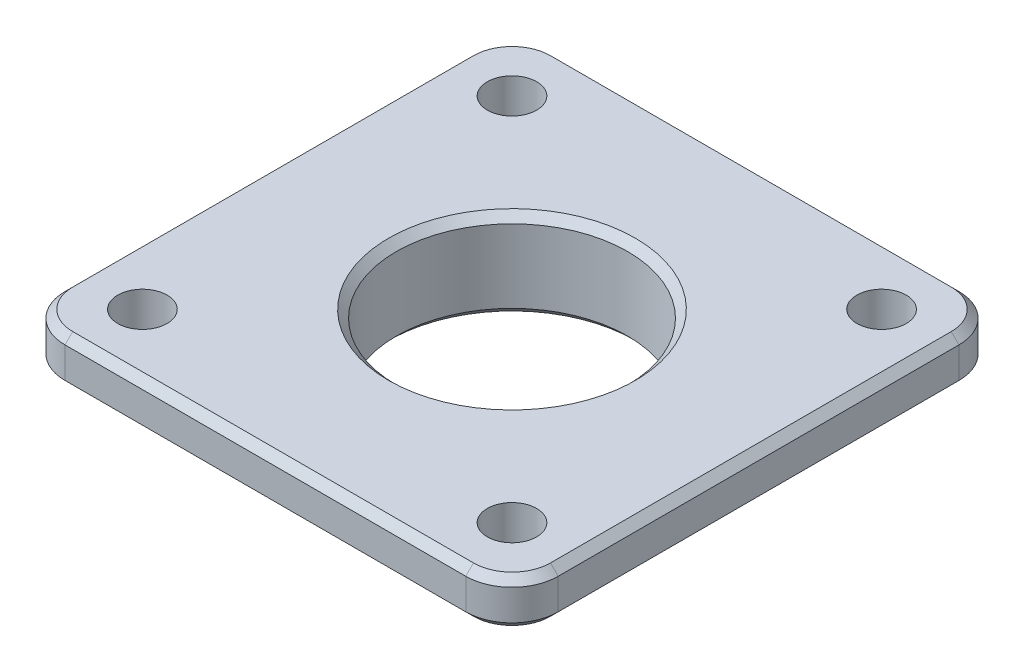
ISO-10303-21;
HEADER;
FILE_DESCRIPTION(('STEP AP214'),'2;1');
FILE_NAME('part.step','',(''),(''),'','','');
FILE_SCHEMA(('AUTOMOTIVE_DESIGN { 1 0 10303 214 1 1 1 1 }'));
ENDSEC;
DATA;
#1=APPLICATION_CONTEXT('core data for automotive mechanical design processes');
#2=APPLICATION_PROTOCOL_DEFINITION('international standard','automotive_design',2000,#1);
#3=PRODUCT_CONTEXT('',#1,'mechanical');
#4=PRODUCT('Part','Part','',(#3));
#5=PRODUCT_RELATED_PRODUCT_CATEGORY('part','',(#4));
#6=PRODUCT_DEFINITION_FORMATION('','',#4);
#7=PRODUCT_DEFINITION_CONTEXT('part definition',#1,'design');
#8=PRODUCT_DEFINITION('design','',#6,#7);
#9=PRODUCT_DEFINITION_SHAPE('','',#8);
#10=(LENGTH_UNIT() NAMED_UNIT(*) SI_UNIT(.MILLI.,.METRE.));
#11=(NAMED_UNIT(*) PLANE_ANGLE_UNIT() SI_UNIT($,.RADIAN.));
#12=(NAMED_UNIT(*) SI_UNIT($,.STERADIAN.) SOLID_ANGLE_UNIT());
#13=UNCERTAINTY_MEASURE_WITH_UNIT(LENGTH_MEASURE(1.E-05),#10,'distance_accuracy_value','');
#14=(GEOMETRIC_REPRESENTATION_CONTEXT(3) GLOBAL_UNCERTAINTY_ASSIGNED_CONTEXT((#13)) GLOBAL_UNIT_ASSIGNED_CONTEXT((#10,
#11,#12)) REPRESENTATION_CONTEXT('',''));
#15=CARTESIAN_POINT('',(0.,0.,0.));
#16=DIRECTION('',(0.,0.,1.));
#17=DIRECTION('',(1.,0.,0.));
#18=AXIS2_PLACEMENT_3D('',#15,#16,#17);
#19=CARTESIAN_POINT('',(-13.,0.,-13.));
#20=DIRECTION('',(0.,1.,0.));
#21=DIRECTION('',(0.,0.,1.));
#22=AXIS2_PLACEMENT_3D('',#19,#20,#21);
#23=PLANE('',#22);
#24=CARTESIAN_POINT('',(13.,0.,-13.));
#25=DIRECTION('',(0.,1.,0.));
#26=DIRECTION('',(0.,0.,1.));
#27=AXIS2_PLACEMENT_3D('',#24,#25,#26);
#28=CIRCLE('',#27,2.5);
#29=CARTESIAN_POINT('',(13.,0.,-15.5));
#30=VERTEX_POINT('',#29);
#31=CARTESIAN_POINT('',(15.5,0.,-13.));
#32=VERTEX_POINT('',#31);
#33=EDGE_CURVE('E299',#30,#32,#28,.F.);
#34=ORIENTED_EDGE('',*,*,#33,.T.);
#35=DIRECTION('',(0.,0.,1.));
#36=VECTOR('',#35,1.);
#37=CARTESIAN_POINT('',(15.5,0.,-13.));
#38=LINE('',#37,#36);
#39=CARTESIAN_POINT('',(15.5,0.,13.));
#40=VERTEX_POINT('',#39);
#41=EDGE_CURVE('E161',#32,#40,#38,.T.);
#42=ORIENTED_EDGE('',*,*,#41,.T.);
#43=CARTESIAN_POINT('',(13.,0.,13.));
#44=DIRECTION('',(0.,1.,0.));
#45=DIRECTION('',(0.,0.,1.));
#46=AXIS2_PLACEMENT_3D('',#43,#44,#45);
#47=CIRCLE('',#46,2.5);
#48=CARTESIAN_POINT('',(13.,0.,15.5));
#49=VERTEX_POINT('',#48);
#50=EDGE_CURVE('E297',#40,#49,#47,.F.);
#51=ORIENTED_EDGE('',*,*,#50,.T.);
#52=DIRECTION('',(-1.,0.,0.));
#53=VECTOR('',#52,1.);
#54=CARTESIAN_POINT('',(-13.,0.,15.5));
#55=LINE('',#54,#53);
#56=CARTESIAN_POINT('',(-13.,0.,15.5));
#57=VERTEX_POINT('',#56);
#58=EDGE_CURVE('E293',#49,#57,#55,.T.);
#59=ORIENTED_EDGE('',*,*,#58,.T.);
#60=CARTESIAN_POINT('',(-13.,0.,13.));
#61=DIRECTION('',(0.,1.,0.));
#62=DIRECTION('',(0.,0.,1.));
#63=AXIS2_PLACEMENT_3D('',#60,#61,#62);
#64=CIRCLE('',#63,2.5);
#65=CARTESIAN_POINT('',(-15.5,0.,13.));
#66=VERTEX_POINT('',#65);
#67=EDGE_CURVE('E289',#57,#66,#64,.F.);
#68=ORIENTED_EDGE('',*,*,#67,.T.);
#69=DIRECTION('',(0.,0.,-1.));
#70=VECTOR('',#69,1.);
#71=CARTESIAN_POINT('',(-15.5,0.,-13.));
#72=LINE('',#71,#70);
#73=CARTESIAN_POINT('',(-15.5,0.,-13.));
#74=VERTEX_POINT('',#73);
#75=EDGE_CURVE('E287',#66,#74,#72,.T.);
#76=ORIENTED_EDGE('',*,*,#75,.T.);
#77=CARTESIAN_POINT('',(-13.,0.,-13.));
#78=DIRECTION('',(0.,1.,0.));
#79=DIRECTION('',(0.,0.,1.));
#80=AXIS2_PLACEMENT_3D('',#77,#78,#79);
#81=CIRCLE('',#80,2.5);
#82=CARTESIAN_POINT('',(-13.,0.,-15.5));
#83=VERTEX_POINT('',#82);
#84=EDGE_CURVE('E291',#74,#83,#81,.F.);
#85=ORIENTED_EDGE('',*,*,#84,.T.);
#86=DIRECTION('',(1.,0.,0.));
#87=VECTOR('',#86,1.);
#88=CARTESIAN_POINT('',(-13.,0.,-15.5));
#89=LINE('',#88,#87);
#90=EDGE_CURVE('E295',#83,#30,#89,.T.);
#91=ORIENTED_EDGE('',*,*,#90,.T.);
#92=EDGE_LOOP('',(#34,#42,#51,#59,#68,#76,#85,#91));
#93=FACE_BOUND('',#92,.T.);
#94=CARTESIAN_POINT('',(-11.988995475018,0.,11.9889954750179));
#95=DIRECTION('',(0.,1.,0.));
#96=DIRECTION('',(0.,0.,-1.));
#97=AXIS2_PLACEMENT_3D('',#94,#95,#96);
#98=CIRCLE('',#97,1.6);
#99=CARTESIAN_POINT('',(-11.988995475018,0.,10.3889954750179));
#100=VERTEX_POINT('',#99);
#101=EDGE_CURVE('E236',#100,#100,#98,.T.);
#102=ORIENTED_EDGE('',*,*,#101,.T.);
#103=EDGE_LOOP('',(#102));
#104=FACE_BOUND('',#103,.T.);
#105=CARTESIAN_POINT('',(11.988995475018,0.,11.9889954750178));
#106=DIRECTION('',(0.,1.,0.));
#107=DIRECTION('',(0.,0.,1.));
#108=AXIS2_PLACEMENT_3D('',#105,#106,#107);
#109=CIRCLE('',#108,1.6);
#110=CARTESIAN_POINT('',(11.988995475018,0.,13.5889954750178));
#111=VERTEX_POINT('',#110);
#112=EDGE_CURVE('E247',#111,#111,#109,.T.);
#113=ORIENTED_EDGE('',*,*,#112,.T.);
#114=EDGE_LOOP('',(#113));
#115=FACE_BOUND('',#114,.T.);
#116=CARTESIAN_POINT('',(11.988995475018,0.,-11.9889954750178));
#117=DIRECTION('',(0.,1.,0.));
#118=DIRECTION('',(0.,0.,-1.));
#119=AXIS2_PLACEMENT_3D('',#116,#117,#118);
#120=CIRCLE('',#119,1.6);
#121=CARTESIAN_POINT('',(11.988995475018,0.,-13.5889954750178));
#122=VERTEX_POINT('',#121);
#123=EDGE_CURVE('E253',#122,#122,#120,.T.);
#124=ORIENTED_EDGE('',*,*,#123,.T.);
#125=EDGE_LOOP('',(#124));
#126=FACE_BOUND('',#125,.T.);
#127=CARTESIAN_POINT('',(-11.988995475018,0.,-11.9889954750178));
#128=DIRECTION('',(0.,1.,0.));
#129=DIRECTION('',(0.,0.,1.));
#130=AXIS2_PLACEMENT_3D('',#127,#128,#129);
#131=CIRCLE('',#130,1.6);
#132=CARTESIAN_POINT('',(-11.988995475018,0.,-10.3889954750178));
#133=VERTEX_POINT('',#132);
#134=EDGE_CURVE('E259',#133,#133,#131,.T.);
#135=ORIENTED_EDGE('',*,*,#134,.T.);
#136=EDGE_LOOP('',(#135));
#137=FACE_BOUND('',#136,.T.);
#138=CARTESIAN_POINT('',(0.,0.,0.));
#139=DIRECTION('',(0.,1.,0.));
#140=DIRECTION('',(0.,0.,1.));
#141=AXIS2_PLACEMENT_3D('',#138,#139,#140);
#142=CIRCLE('',#141,12.3);
#143=CARTESIAN_POINT('',(0.,0.,12.3));
#144=VERTEX_POINT('',#143);
#145=EDGE_CURVE('E177',#144,#144,#142,.F.);
#146=ORIENTED_EDGE('',*,*,#145,.F.);
#147=EDGE_LOOP('',(#146));
#148=FACE_BOUND('',#147,.T.);
#149=ADVANCED_FACE('F32',(#93,#104,#115,#126,#137,#148),#23,.F.);
#150=CARTESIAN_POINT('',(-13.,3.,-13.));
#151=DIRECTION('',(0.,1.,0.));
#152=DIRECTION('',(0.,0.,1.));
#153=AXIS2_PLACEMENT_3D('',#150,#151,#152);
#154=PLANE('',#153);
#155=CARTESIAN_POINT('',(13.,3.,13.));
#156=DIRECTION('',(0.,1.,0.));
#157=DIRECTION('',(0.,0.,1.));
#158=AXIS2_PLACEMENT_3D('',#155,#156,#157);
#159=CIRCLE('',#158,2.50000000000001);
#160=CARTESIAN_POINT('',(13.,3.,15.5));
#161=VERTEX_POINT('',#160);
#162=CARTESIAN_POINT('',(15.5,3.,13.));
#163=VERTEX_POINT('',#162);
#164=EDGE_CURVE('E57',#161,#163,#159,.T.);
#165=ORIENTED_EDGE('',*,*,#164,.T.);
#166=DIRECTION('',(0.,0.,-1.));
#167=VECTOR('',#166,1.);
#168=CARTESIAN_POINT('',(15.5,3.,-13.));
#169=LINE('',#168,#167);
#170=CARTESIAN_POINT('',(15.5,3.,-13.));
#171=VERTEX_POINT('',#170);
#172=EDGE_CURVE('E343',#163,#171,#169,.T.);
#173=ORIENTED_EDGE('',*,*,#172,.T.);
#174=CARTESIAN_POINT('',(13.,3.,-13.));
#175=DIRECTION('',(0.,1.,0.));
#176=DIRECTION('',(0.,0.,1.));
#177=AXIS2_PLACEMENT_3D('',#174,#175,#176);
#178=CIRCLE('',#177,2.50000000000001);
#179=CARTESIAN_POINT('',(13.,3.,-15.5));
#180=VERTEX_POINT('',#179);
#181=EDGE_CURVE('E180',#171,#180,#178,.T.);
#182=ORIENTED_EDGE('',*,*,#181,.T.);
#183=DIRECTION('',(-1.,0.,0.));
#184=VECTOR('',#183,1.);
#185=CARTESIAN_POINT('',(-13.,3.,-15.5));
#186=LINE('',#185,#184);
#187=CARTESIAN_POINT('',(-13.,3.,-15.5));
#188=VERTEX_POINT('',#187);
#189=EDGE_CURVE('E339',#180,#188,#186,.T.);
#190=ORIENTED_EDGE('',*,*,#189,.T.);
#191=CARTESIAN_POINT('',(-13.,3.,-13.));
#192=DIRECTION('',(0.,1.,0.));
#193=DIRECTION('',(0.,0.,1.));
#194=AXIS2_PLACEMENT_3D('',#191,#192,#193);
#195=CIRCLE('',#194,2.50000000000001);
#196=CARTESIAN_POINT('',(-15.5,3.,-13.));
#197=VERTEX_POINT('',#196);
#198=EDGE_CURVE('E335',#188,#197,#195,.T.);
#199=ORIENTED_EDGE('',*,*,#198,.T.);
#200=DIRECTION('',(0.,0.,1.));
#201=VECTOR('',#200,1.);
#202=CARTESIAN_POINT('',(-15.5,3.,13.));
#203=LINE('',#202,#201);
#204=CARTESIAN_POINT('',(-15.5,3.,13.));
#205=VERTEX_POINT('',#204);
#206=EDGE_CURVE('E331',#197,#205,#203,.T.);
#207=ORIENTED_EDGE('',*,*,#206,.T.);
#208=CARTESIAN_POINT('',(-13.,3.,13.));
#209=DIRECTION('',(0.,1.,0.));
#210=DIRECTION('',(0.,0.,1.));
#211=AXIS2_PLACEMENT_3D('',#208,#209,#210);
#212=CIRCLE('',#211,2.50000000000001);
#213=CARTESIAN_POINT('',(-13.,3.,15.5));
#214=VERTEX_POINT('',#213);
#215=EDGE_CURVE('E333',#205,#214,#212,.T.);
#216=ORIENTED_EDGE('',*,*,#215,.T.);
#217=DIRECTION('',(1.,0.,0.));
#218=VECTOR('',#217,1.);
#219=CARTESIAN_POINT('',(13.,3.,15.5));
#220=LINE('',#219,#218);
#221=EDGE_CURVE('E337',#214,#161,#220,.T.);
#222=ORIENTED_EDGE('',*,*,#221,.T.);
#223=EDGE_LOOP('',(#165,#173,#182,#190,#199,#207,#216,#222));
#224=FACE_BOUND('',#223,.T.);
#225=CARTESIAN_POINT('',(0.,3.,0.));
#226=DIRECTION('',(0.,1.,0.));
#227=DIRECTION('',(0.,0.,1.));
#228=AXIS2_PLACEMENT_3D('',#225,#226,#227);
#229=CIRCLE('',#228,8.);
#230=CARTESIAN_POINT('',(0.,3.,8.));
#231=VERTEX_POINT('',#230);
#232=EDGE_CURVE('E328',#231,#231,#229,.F.);
#233=ORIENTED_EDGE('',*,*,#232,.T.);
#234=EDGE_LOOP('',(#233));
#235=FACE_BOUND('',#234,.T.);
#236=CARTESIAN_POINT('',(11.988995475018,3.,11.9889954750178));
#237=DIRECTION('',(0.,1.,0.));
#238=DIRECTION('',(0.,0.,1.));
#239=AXIS2_PLACEMENT_3D('',#236,#237,#238);
#240=CIRCLE('',#239,1.6);
#241=CARTESIAN_POINT('',(11.988995475018,3.,13.5889954750178));
#242=VERTEX_POINT('',#241);
#243=EDGE_CURVE('E250',#242,#242,#240,.T.);
#244=ORIENTED_EDGE('',*,*,#243,.F.);
#245=EDGE_LOOP('',(#244));
#246=FACE_BOUND('',#245,.T.);
#247=CARTESIAN_POINT('',(-11.988995475018,3.,-11.9889954750178));
#248=DIRECTION('',(0.,1.,0.));
#249=DIRECTION('',(0.,0.,1.));
#250=AXIS2_PLACEMENT_3D('',#247,#248,#249);
#251=CIRCLE('',#250,1.6);
#252=CARTESIAN_POINT('',(-11.988995475018,3.,-10.3889954750178));
#253=VERTEX_POINT('',#252);
#254=EDGE_CURVE('E262',#253,#253,#251,.T.);
#255=ORIENTED_EDGE('',*,*,#254,.F.);
#256=EDGE_LOOP('',(#255));
#257=FACE_BOUND('',#256,.T.);
#258=CARTESIAN_POINT('',(11.988995475018,3.,-11.9889954750178));
#259=DIRECTION('',(0.,1.,0.));
#260=DIRECTION('',(0.,0.,-1.));
#261=AXIS2_PLACEMENT_3D('',#258,#259,#260);
#262=CIRCLE('',#261,1.6);
#263=CARTESIAN_POINT('',(11.988995475018,3.,-13.5889954750178));
#264=VERTEX_POINT('',#263);
#265=EDGE_CURVE('E256',#264,#264,#262,.T.);
#266=ORIENTED_EDGE('',*,*,#265,.F.);
#267=EDGE_LOOP('',(#266));
#268=FACE_BOUND('',#267,.T.);
#269=CARTESIAN_POINT('',(-11.988995475018,3.,11.9889954750179));
#270=DIRECTION('',(0.,1.,0.));
#271=DIRECTION('',(0.,0.,-1.));
#272=AXIS2_PLACEMENT_3D('',#269,#270,#271);
#273=CIRCLE('',#272,1.6);
#274=CARTESIAN_POINT('',(-11.988995475018,3.,10.3889954750179));
#275=VERTEX_POINT('',#274);
#276=EDGE_CURVE('E242',#275,#275,#273,.T.);
#277=ORIENTED_EDGE('',*,*,#276,.F.);
#278=EDGE_LOOP('',(#277));
#279=FACE_BOUND('',#278,.T.);
#280=ADVANCED_FACE('F382',(#224,#235,#246,#257,#268,#279),#154,.T.);
#281=CARTESIAN_POINT('',(-13.,3.,-13.));
#282=DIRECTION('',(0.,-1.,0.));
#283=DIRECTION('',(0.,0.,-1.));
#284=AXIS2_PLACEMENT_3D('',#281,#282,#283);
#285=CYLINDRICAL_SURFACE('',#284,3.);
#286=DIRECTION('',(0.,-1.,0.));
#287=VECTOR('',#286,1.);
#288=CARTESIAN_POINT('',(-13.,3.,-16.));
#289=LINE('',#288,#287);
#290=CARTESIAN_POINT('',(-13.,2.5,-16.));
#291=VERTEX_POINT('',#290);
#292=CARTESIAN_POINT('',(-13.,0.5,-16.));
#293=VERTEX_POINT('',#292);
#294=EDGE_CURVE('E265',#291,#293,#289,.T.);
#295=ORIENTED_EDGE('',*,*,#294,.T.);
#296=CARTESIAN_POINT('',(-13.,0.5,-13.));
#297=DIRECTION('',(0.,1.,0.));
#298=DIRECTION('',(0.,0.,1.));
#299=AXIS2_PLACEMENT_3D('',#296,#297,#298);
#300=CIRCLE('',#299,3.);
#301=CARTESIAN_POINT('',(-16.,0.5,-13.));
#302=VERTEX_POINT('',#301);
#303=EDGE_CURVE('E318',#293,#302,#300,.T.);
#304=ORIENTED_EDGE('',*,*,#303,.T.);
#305=DIRECTION('',(0.,-1.,0.));
#306=VECTOR('',#305,1.);
#307=CARTESIAN_POINT('',(-16.,3.,-13.));
#308=LINE('',#307,#306);
#309=CARTESIAN_POINT('',(-16.,2.5,-13.));
#310=VERTEX_POINT('',#309);
#311=EDGE_CURVE('E281',#310,#302,#308,.T.);
#312=ORIENTED_EDGE('',*,*,#311,.F.);
#313=CARTESIAN_POINT('',(-13.,2.5,-13.));
#314=DIRECTION('',(0.,1.,0.));
#315=DIRECTION('',(0.,0.,1.));
#316=AXIS2_PLACEMENT_3D('',#313,#314,#315);
#317=CIRCLE('',#316,3.);
#318=EDGE_CURVE('E316',#310,#291,#317,.F.);
#319=ORIENTED_EDGE('',*,*,#318,.T.);
#320=EDGE_LOOP('',(#295,#304,#312,#319));
#321=FACE_BOUND('',#320,.T.);
#322=ADVANCED_FACE('F388',(#321),#285,.T.);
#323=CARTESIAN_POINT('',(-16.,3.,13.));
#324=DIRECTION('',(1.,0.,0.));
#325=DIRECTION('',(0.,0.,-1.));
#326=AXIS2_PLACEMENT_3D('',#323,#324,#325);
#327=PLANE('',#326);
#328=ORIENTED_EDGE('',*,*,#311,.T.);
#329=DIRECTION('',(0.,0.,1.));
#330=VECTOR('',#329,1.);
#331=CARTESIAN_POINT('',(-16.,0.5,13.));
#332=LINE('',#331,#330);
#333=CARTESIAN_POINT('',(-16.,0.5,13.));
#334=VERTEX_POINT('',#333);
#335=EDGE_CURVE('E326',#302,#334,#332,.T.);
#336=ORIENTED_EDGE('',*,*,#335,.T.);
#337=DIRECTION('',(0.,-1.,0.));
#338=VECTOR('',#337,1.);
#339=CARTESIAN_POINT('',(-16.,3.,13.));
#340=LINE('',#339,#338);
#341=CARTESIAN_POINT('',(-16.,2.5,13.));
#342=VERTEX_POINT('',#341);
#343=EDGE_CURVE('E278',#342,#334,#340,.T.);
#344=ORIENTED_EDGE('',*,*,#343,.F.);
#345=DIRECTION('',(0.,0.,-1.));
#346=VECTOR('',#345,1.);
#347=CARTESIAN_POINT('',(-16.,2.5,-13.));
#348=LINE('',#347,#346);
#349=EDGE_CURVE('E324',#342,#310,#348,.T.);
#350=ORIENTED_EDGE('',*,*,#349,.T.);
#351=EDGE_LOOP('',(#328,#336,#344,#350));
#352=FACE_BOUND('',#351,.T.);
#353=ADVANCED_FACE('F405',(#352),#327,.F.);
#354=CARTESIAN_POINT('',(-13.,3.,13.));
#355=DIRECTION('',(0.,-1.,0.));
#356=DIRECTION('',(0.,0.,-1.));
#357=AXIS2_PLACEMENT_3D('',#354,#355,#356);
#358=CYLINDRICAL_SURFACE('',#357,3.);
#359=ORIENTED_EDGE('',*,*,#343,.T.);
#360=CARTESIAN_POINT('',(-13.,0.5,13.));
#361=DIRECTION('',(0.,1.,0.));
#362=DIRECTION('',(0.,0.,1.));
#363=AXIS2_PLACEMENT_3D('',#360,#361,#362);
#364=CIRCLE('',#363,3.);
#365=CARTESIAN_POINT('',(-13.,0.5,16.));
#366=VERTEX_POINT('',#365);
#367=EDGE_CURVE('E322',#334,#366,#364,.T.);
#368=ORIENTED_EDGE('',*,*,#367,.T.);
#369=DIRECTION('',(0.,-1.,0.));
#370=VECTOR('',#369,1.);
#371=CARTESIAN_POINT('',(-13.,3.,16.));
#372=LINE('',#371,#370);
#373=CARTESIAN_POINT('',(-13.,2.5,16.));
#374=VERTEX_POINT('',#373);
#375=EDGE_CURVE('E275',#374,#366,#372,.T.);
#376=ORIENTED_EDGE('',*,*,#375,.F.);
#377=CARTESIAN_POINT('',(-13.,2.5,13.));
#378=DIRECTION('',(0.,1.,0.));
#379=DIRECTION('',(0.,0.,1.));
#380=AXIS2_PLACEMENT_3D('',#377,#378,#379);
#381=CIRCLE('',#380,3.);
#382=EDGE_CURVE('E320',#374,#342,#381,.F.);
#383=ORIENTED_EDGE('',*,*,#382,.T.);
#384=EDGE_LOOP('',(#359,#368,#376,#383));
#385=FACE_BOUND('',#384,.T.);
#386=ADVANCED_FACE('F401',(#385),#358,.T.);
#387=CARTESIAN_POINT('',(-13.,3.,16.));
#388=DIRECTION('',(0.,0.,-1.));
#389=DIRECTION('',(-1.,0.,0.));
#390=AXIS2_PLACEMENT_3D('',#387,#388,#389);
#391=PLANE('',#390);
#392=ORIENTED_EDGE('',*,*,#375,.T.);
#393=DIRECTION('',(1.,0.,0.));
#394=VECTOR('',#393,1.);
#395=CARTESIAN_POINT('',(-13.,0.5,16.));
#396=LINE('',#395,#394);
#397=CARTESIAN_POINT('',(13.,0.5,16.));
#398=VERTEX_POINT('',#397);
#399=EDGE_CURVE('E314',#366,#398,#396,.T.);
#400=ORIENTED_EDGE('',*,*,#399,.T.);
#401=DIRECTION('',(0.,-1.,0.));
#402=VECTOR('',#401,1.);
#403=CARTESIAN_POINT('',(13.,3.,16.));
#404=LINE('',#403,#402);
#405=CARTESIAN_POINT('',(13.,2.5,16.));
#406=VERTEX_POINT('',#405);
#407=EDGE_CURVE('E272',#406,#398,#404,.T.);
#408=ORIENTED_EDGE('',*,*,#407,.F.);
#409=DIRECTION('',(-1.,0.,0.));
#410=VECTOR('',#409,1.);
#411=CARTESIAN_POINT('',(-13.,2.5,16.));
#412=LINE('',#411,#410);
#413=EDGE_CURVE('E312',#406,#374,#412,.T.);
#414=ORIENTED_EDGE('',*,*,#413,.T.);
#415=EDGE_LOOP('',(#392,#400,#408,#414));
#416=FACE_BOUND('',#415,.T.);
#417=ADVANCED_FACE('F397',(#416),#391,.F.);
#418=CARTESIAN_POINT('',(13.,3.,13.));
#419=DIRECTION('',(0.,-1.,0.));
#420=DIRECTION('',(0.,0.,-1.));
#421=AXIS2_PLACEMENT_3D('',#418,#419,#420);
#422=CYLINDRICAL_SURFACE('',#421,3.);
#423=ORIENTED_EDGE('',*,*,#407,.T.);
#424=CARTESIAN_POINT('',(13.,0.5,13.));
#425=DIRECTION('',(0.,1.,0.));
#426=DIRECTION('',(0.,0.,1.));
#427=AXIS2_PLACEMENT_3D('',#424,#425,#426);
#428=CIRCLE('',#427,3.);
#429=CARTESIAN_POINT('',(16.,0.5,13.));
#430=VERTEX_POINT('',#429);
#431=EDGE_CURVE('E306',#398,#430,#428,.T.);
#432=ORIENTED_EDGE('',*,*,#431,.T.);
#433=DIRECTION('',(0.,-1.,0.));
#434=VECTOR('',#433,1.);
#435=CARTESIAN_POINT('',(16.,3.,13.));
#436=LINE('',#435,#434);
#437=CARTESIAN_POINT('',(16.,2.5,13.));
#438=VERTEX_POINT('',#437);
#439=EDGE_CURVE('E172',#438,#430,#436,.T.);
#440=ORIENTED_EDGE('',*,*,#439,.F.);
#441=CARTESIAN_POINT('',(13.,2.5,13.));
#442=DIRECTION('',(0.,1.,0.));
#443=DIRECTION('',(0.,0.,1.));
#444=AXIS2_PLACEMENT_3D('',#441,#442,#443);
#445=CIRCLE('',#444,3.);
#446=EDGE_CURVE('E304',#438,#406,#445,.F.);
#447=ORIENTED_EDGE('',*,*,#446,.T.);
#448=EDGE_LOOP('',(#423,#432,#440,#447));
#449=FACE_BOUND('',#448,.T.);
#450=ADVANCED_FACE('F394',(#449),#422,.T.);
#451=CARTESIAN_POINT('',(16.,3.,13.));
#452=DIRECTION('',(-1.,0.,0.));
#453=DIRECTION('',(0.,0.,1.));
#454=AXIS2_PLACEMENT_3D('',#451,#452,#453);
#455=PLANE('',#454);
#456=ORIENTED_EDGE('',*,*,#439,.T.);
#457=DIRECTION('',(0.,0.,-1.));
#458=VECTOR('',#457,1.);
#459=CARTESIAN_POINT('',(16.,0.5,13.));
#460=LINE('',#459,#458);
#461=CARTESIAN_POINT('',(16.,0.5,-13.));
#462=VERTEX_POINT('',#461);
#463=EDGE_CURVE('E171',#430,#462,#460,.T.);
#464=ORIENTED_EDGE('',*,*,#463,.T.);
#465=DIRECTION('',(0.,-1.,0.));
#466=VECTOR('',#465,1.);
#467=CARTESIAN_POINT('',(16.,3.,-13.));
#468=LINE('',#467,#466);
#469=CARTESIAN_POINT('',(16.,2.5,-13.));
#470=VERTEX_POINT('',#469);
#471=EDGE_CURVE('E154',#470,#462,#468,.T.);
#472=ORIENTED_EDGE('',*,*,#471,.F.);
#473=DIRECTION('',(0.,0.,1.));
#474=VECTOR('',#473,1.);
#475=CARTESIAN_POINT('',(16.,2.5,13.));
#476=LINE('',#475,#474);
#477=EDGE_CURVE('E168',#470,#438,#476,.T.);
#478=ORIENTED_EDGE('',*,*,#477,.T.);
#479=EDGE_LOOP('',(#456,#464,#472,#478));
#480=FACE_BOUND('',#479,.T.);
#481=ADVANCED_FACE('F167',(#480),#455,.F.);
#482=CARTESIAN_POINT('',(13.,3.,-13.));
#483=DIRECTION('',(0.,-1.,0.));
#484=DIRECTION('',(0.,0.,-1.));
#485=AXIS2_PLACEMENT_3D('',#482,#483,#484);
#486=CYLINDRICAL_SURFACE('',#485,3.);
#487=ORIENTED_EDGE('',*,*,#471,.T.);
#488=CARTESIAN_POINT('',(13.,0.5,-13.));
#489=DIRECTION('',(0.,1.,0.));
#490=DIRECTION('',(0.,0.,1.));
#491=AXIS2_PLACEMENT_3D('',#488,#489,#490);
#492=CIRCLE('',#491,3.);
#493=CARTESIAN_POINT('',(13.,0.5,-16.));
#494=VERTEX_POINT('',#493);
#495=EDGE_CURVE('E160',#462,#494,#492,.T.);
#496=ORIENTED_EDGE('',*,*,#495,.T.);
#497=DIRECTION('',(0.,-1.,0.));
#498=VECTOR('',#497,1.);
#499=CARTESIAN_POINT('',(13.,3.,-16.));
#500=LINE('',#499,#498);
#501=CARTESIAN_POINT('',(13.,2.5,-16.));
#502=VERTEX_POINT('',#501);
#503=EDGE_CURVE('E156',#502,#494,#500,.T.);
#504=ORIENTED_EDGE('',*,*,#503,.F.);
#505=CARTESIAN_POINT('',(13.,2.5,-13.));
#506=DIRECTION('',(0.,1.,0.));
#507=DIRECTION('',(0.,0.,1.));
#508=AXIS2_PLACEMENT_3D('',#505,#506,#507);
#509=CIRCLE('',#508,3.);
#510=EDGE_CURVE('E151',#502,#470,#509,.F.);
#511=ORIENTED_EDGE('',*,*,#510,.T.);
#512=EDGE_LOOP('',(#487,#496,#504,#511));
#513=FACE_BOUND('',#512,.T.);
#514=ADVANCED_FACE('F153',(#513),#486,.T.);
#515=CARTESIAN_POINT('',(-13.,3.,-16.));
#516=DIRECTION('',(0.,0.,1.));
#517=DIRECTION('',(1.,0.,0.));
#518=AXIS2_PLACEMENT_3D('',#515,#516,#517);
#519=PLANE('',#518);
#520=ORIENTED_EDGE('',*,*,#503,.T.);
#521=DIRECTION('',(-1.,0.,0.));
#522=VECTOR('',#521,1.);
#523=CARTESIAN_POINT('',(-13.,0.5,-16.));
#524=LINE('',#523,#522);
#525=EDGE_CURVE('E310',#494,#293,#524,.T.);
#526=ORIENTED_EDGE('',*,*,#525,.T.);
#527=ORIENTED_EDGE('',*,*,#294,.F.);
#528=DIRECTION('',(1.,0.,0.));
#529=VECTOR('',#528,1.);
#530=CARTESIAN_POINT('',(13.,2.5,-16.));
#531=LINE('',#530,#529);
#532=EDGE_CURVE('E308',#291,#502,#531,.T.);
#533=ORIENTED_EDGE('',*,*,#532,.T.);
#534=EDGE_LOOP('',(#520,#526,#527,#533));
#535=FACE_BOUND('',#534,.T.);
#536=ADVANCED_FACE('F368',(#535),#519,.F.);
#537=CARTESIAN_POINT('',(0.,3.,0.));
#538=DIRECTION('',(0.,-1.,0.));
#539=DIRECTION('',(0.,0.,-1.));
#540=AXIS2_PLACEMENT_3D('',#537,#538,#539);
#541=CYLINDRICAL_SURFACE('',#540,7.5);
#542=CARTESIAN_POINT('',(0.,2.5,0.));
#543=DIRECTION('',(0.,1.,0.));
#544=DIRECTION('',(0.,0.,1.));
#545=AXIS2_PLACEMENT_3D('',#542,#543,#544);
#546=CIRCLE('',#545,7.5);
#547=CARTESIAN_POINT('',(0.,2.5,7.5));
#548=VERTEX_POINT('',#547);
#549=EDGE_CURVE('E348',#548,#548,#546,.T.);
#550=ORIENTED_EDGE('',*,*,#549,.T.);
#551=EDGE_LOOP('',(#550));
#552=FACE_BOUND('',#551,.T.);
#553=CARTESIAN_POINT('',(0.,-2.24999999999999,0.));
#554=DIRECTION('',(0.,-1.,0.));
#555=DIRECTION('',(0.,0.,-1.));
#556=AXIS2_PLACEMENT_3D('',#553,#554,#555);
#557=CIRCLE('',#556,7.5);
#558=CARTESIAN_POINT('',(0.,-2.24999999999999,-7.5));
#559=VERTEX_POINT('',#558);
#560=EDGE_CURVE('E345',#559,#559,#557,.T.);
#561=ORIENTED_EDGE('',*,*,#560,.T.);
#562=EDGE_LOOP('',(#561));
#563=FACE_BOUND('',#562,.T.);
#564=ADVANCED_FACE('F365',(#552,#563),#541,.F.);
#565=CARTESIAN_POINT('',(-11.988995475018,3.,-11.9889954750178));
#566=DIRECTION('',(0.,-1.,0.));
#567=DIRECTION('',(0.,0.,-1.));
#568=AXIS2_PLACEMENT_3D('',#565,#566,#567);
#569=CYLINDRICAL_SURFACE('',#568,1.6);
#570=ORIENTED_EDGE('',*,*,#254,.T.);
#571=EDGE_LOOP('',(#570));
#572=FACE_BOUND('',#571,.T.);
#573=ORIENTED_EDGE('',*,*,#134,.F.);
#574=EDGE_LOOP('',(#573));
#575=FACE_BOUND('',#574,.T.);
#576=ADVANCED_FACE('F367',(#572,#575),#569,.F.);
#577=CARTESIAN_POINT('',(11.988995475018,3.,-11.9889954750178));
#578=DIRECTION('',(0.,-1.,0.));
#579=DIRECTION('',(0.,0.,-1.));
#580=AXIS2_PLACEMENT_3D('',#577,#578,#579);
#581=CYLINDRICAL_SURFACE('',#580,1.6);
#582=ORIENTED_EDGE('',*,*,#265,.T.);
#583=EDGE_LOOP('',(#582));
#584=FACE_BOUND('',#583,.T.);
#585=ORIENTED_EDGE('',*,*,#123,.F.);
#586=EDGE_LOOP('',(#585));
#587=FACE_BOUND('',#586,.T.);
#588=ADVANCED_FACE('F375',(#584,#587),#581,.F.);
#589=CARTESIAN_POINT('',(11.988995475018,3.,11.9889954750178));
#590=DIRECTION('',(0.,-1.,0.));
#591=DIRECTION('',(0.,0.,-1.));
#592=AXIS2_PLACEMENT_3D('',#589,#590,#591);
#593=CYLINDRICAL_SURFACE('',#592,1.6);
#594=ORIENTED_EDGE('',*,*,#243,.T.);
#595=EDGE_LOOP('',(#594));
#596=FACE_BOUND('',#595,.T.);
#597=ORIENTED_EDGE('',*,*,#112,.F.);
#598=EDGE_LOOP('',(#597));
#599=FACE_BOUND('',#598,.T.);
#600=ADVANCED_FACE('F489',(#596,#599),#593,.F.);
#601=CARTESIAN_POINT('',(-11.988995475018,3.,11.9889954750179));
#602=DIRECTION('',(0.,-1.,0.));
#603=DIRECTION('',(0.,0.,-1.));
#604=AXIS2_PLACEMENT_3D('',#601,#602,#603);
#605=CYLINDRICAL_SURFACE('',#604,1.6);
#606=ORIENTED_EDGE('',*,*,#276,.T.);
#607=EDGE_LOOP('',(#606));
#608=FACE_BOUND('',#607,.T.);
#609=ORIENTED_EDGE('',*,*,#101,.F.);
#610=EDGE_LOOP('',(#609));
#611=FACE_BOUND('',#610,.T.);
#612=ADVANCED_FACE('F486',(#608,#611),#605,.F.);
#613=CARTESIAN_POINT('',(0.,-2.75,0.));
#614=DIRECTION('',(0.,-1.,0.));
#615=DIRECTION('',(0.,0.,-1.));
#616=AXIS2_PLACEMENT_3D('',#613,#614,#615);
#617=PLANE('',#616);
#618=CARTESIAN_POINT('',(0.,-2.75,0.));
#619=DIRECTION('',(0.,-1.,0.));
#620=DIRECTION('',(0.,0.,-1.));
#621=AXIS2_PLACEMENT_3D('',#618,#619,#620);
#622=CIRCLE('',#621,8.00000000000001);
#623=CARTESIAN_POINT('',(0.,-2.75,-8.00000000000001));
#624=VERTEX_POINT('',#623);
#625=EDGE_CURVE('E41',#624,#624,#622,.F.);
#626=ORIENTED_EDGE('',*,*,#625,.T.);
#627=EDGE_LOOP('',(#626));
#628=FACE_BOUND('',#627,.T.);
#629=CARTESIAN_POINT('',(0.,-2.75,0.));
#630=DIRECTION('',(0.,-1.,0.));
#631=DIRECTION('',(0.,0.,-1.));
#632=AXIS2_PLACEMENT_3D('',#629,#630,#631);
#633=CIRCLE('',#632,11.8);
#634=CARTESIAN_POINT('',(0.,-2.75,-11.8));
#635=VERTEX_POINT('',#634);
#636=EDGE_CURVE('E351',#635,#635,#633,.T.);
#637=ORIENTED_EDGE('',*,*,#636,.T.);
#638=EDGE_LOOP('',(#637));
#639=FACE_BOUND('',#638,.T.);
#640=ADVANCED_FACE('F356',(#628,#639),#617,.T.);
#641=CARTESIAN_POINT('',(0.,-2.75,0.));
#642=DIRECTION('',(0.,1.,0.));
#643=DIRECTION('',(0.,0.,1.));
#644=AXIS2_PLACEMENT_3D('',#641,#642,#643);
#645=CYLINDRICAL_SURFACE('',#644,12.3);
#646=CARTESIAN_POINT('',(0.,-2.25,0.));
#647=DIRECTION('',(0.,-1.,0.));
#648=DIRECTION('',(0.,0.,-1.));
#649=AXIS2_PLACEMENT_3D('',#646,#647,#648);
#650=CIRCLE('',#649,12.3);
#651=CARTESIAN_POINT('',(0.,-2.25,-12.3));
#652=VERTEX_POINT('',#651);
#653=EDGE_CURVE('E11',#652,#652,#650,.F.);
#654=ORIENTED_EDGE('',*,*,#653,.T.);
#655=EDGE_LOOP('',(#654));
#656=FACE_BOUND('',#655,.T.);
#657=ORIENTED_EDGE('',*,*,#145,.T.);
#658=EDGE_LOOP('',(#657));
#659=FACE_BOUND('',#658,.T.);
#660=ADVANCED_FACE('F442',(#656,#659),#645,.T.);
#661=CARTESIAN_POINT('',(-16.,0.5,13.));
#662=DIRECTION('',(0.707106781186547,0.707106781186547,0.));
#663=DIRECTION('',(0.,0.,1.));
#664=AXIS2_PLACEMENT_3D('',#661,#662,#663);
#665=PLANE('',#664);
#666=DIRECTION('',(-0.707106781186547,0.707106781186547,0.));
#667=VECTOR('',#666,1.);
#668=CARTESIAN_POINT('',(-15.5,0.,-13.));
#669=LINE('',#668,#667);
#670=EDGE_CURVE('E229',#74,#302,#669,.T.);
#671=ORIENTED_EDGE('',*,*,#670,.F.);
#672=ORIENTED_EDGE('',*,*,#75,.F.);
#673=DIRECTION('',(0.707106781186547,-0.707106781186547,0.));
#674=VECTOR('',#673,1.);
#675=CARTESIAN_POINT('',(-16.,0.5,13.));
#676=LINE('',#675,#674);
#677=EDGE_CURVE('E185',#334,#66,#676,.T.);
#678=ORIENTED_EDGE('',*,*,#677,.F.);
#679=ORIENTED_EDGE('',*,*,#335,.F.);
#680=EDGE_LOOP('',(#671,#672,#678,#679));
#681=FACE_BOUND('',#680,.T.);
#682=ADVANCED_FACE('F439',(#681),#665,.F.);
#683=CARTESIAN_POINT('',(-13.,0.5,13.));
#684=DIRECTION('',(0.,1.,0.));
#685=DIRECTION('',(0.,0.,1.));
#686=AXIS2_PLACEMENT_3D('',#683,#684,#685);
#687=CONICAL_SURFACE('',#686,3.,0.785398163397448);
#688=ORIENTED_EDGE('',*,*,#677,.T.);
#689=ORIENTED_EDGE('',*,*,#67,.F.);
#690=DIRECTION('',(0.,-0.707106781186547,-0.707106781186547));
#691=VECTOR('',#690,1.);
#692=CARTESIAN_POINT('',(-13.,0.5,16.));
#693=LINE('',#692,#691);
#694=EDGE_CURVE('E227',#366,#57,#693,.T.);
#695=ORIENTED_EDGE('',*,*,#694,.F.);
#696=ORIENTED_EDGE('',*,*,#367,.F.);
#697=EDGE_LOOP('',(#688,#689,#695,#696));
#698=FACE_BOUND('',#697,.T.);
#699=ADVANCED_FACE('F436',(#698),#687,.T.);
#700=CARTESIAN_POINT('',(-13.,0.5,-13.));
#701=DIRECTION('',(0.,1.,0.));
#702=DIRECTION('',(0.,0.,1.));
#703=AXIS2_PLACEMENT_3D('',#700,#701,#702);
#704=CONICAL_SURFACE('',#703,3.,0.785398163397448);
#705=ORIENTED_EDGE('',*,*,#670,.T.);
#706=ORIENTED_EDGE('',*,*,#303,.F.);
#707=DIRECTION('',(0.,0.707106781186547,-0.707106781186547));
#708=VECTOR('',#707,1.);
#709=CARTESIAN_POINT('',(-13.,0.,-15.5));
#710=LINE('',#709,#708);
#711=EDGE_CURVE('E224',#83,#293,#710,.T.);
#712=ORIENTED_EDGE('',*,*,#711,.F.);
#713=ORIENTED_EDGE('',*,*,#84,.F.);
#714=EDGE_LOOP('',(#705,#706,#712,#713));
#715=FACE_BOUND('',#714,.T.);
#716=ADVANCED_FACE('F432',(#715),#704,.T.);
#717=CARTESIAN_POINT('',(-13.,0.5,16.));
#718=DIRECTION('',(0.,0.707106781186547,-0.707106781186547));
#719=DIRECTION('',(1.,0.,0.));
#720=AXIS2_PLACEMENT_3D('',#717,#718,#719);
#721=PLANE('',#720);
#722=ORIENTED_EDGE('',*,*,#694,.T.);
#723=ORIENTED_EDGE('',*,*,#58,.F.);
#724=DIRECTION('',(0.,-0.707106781186547,-0.707106781186547));
#725=VECTOR('',#724,1.);
#726=CARTESIAN_POINT('',(13.,0.5,16.));
#727=LINE('',#726,#725);
#728=EDGE_CURVE('E221',#398,#49,#727,.T.);
#729=ORIENTED_EDGE('',*,*,#728,.F.);
#730=ORIENTED_EDGE('',*,*,#399,.F.);
#731=EDGE_LOOP('',(#722,#723,#729,#730));
#732=FACE_BOUND('',#731,.T.);
#733=ADVANCED_FACE('F428',(#732),#721,.F.);
#734=CARTESIAN_POINT('',(-13.,0.5,-16.));
#735=DIRECTION('',(0.,0.707106781186547,0.707106781186547));
#736=DIRECTION('',(-1.,0.,0.));
#737=AXIS2_PLACEMENT_3D('',#734,#735,#736);
#738=PLANE('',#737);
#739=ORIENTED_EDGE('',*,*,#711,.T.);
#740=ORIENTED_EDGE('',*,*,#525,.F.);
#741=DIRECTION('',(0.,0.707106781186547,-0.707106781186547));
#742=VECTOR('',#741,1.);
#743=CARTESIAN_POINT('',(13.,0.,-15.5));
#744=LINE('',#743,#742);
#745=EDGE_CURVE('E215',#30,#494,#744,.T.);
#746=ORIENTED_EDGE('',*,*,#745,.F.);
#747=ORIENTED_EDGE('',*,*,#90,.F.);
#748=EDGE_LOOP('',(#739,#740,#746,#747));
#749=FACE_BOUND('',#748,.T.);
#750=ADVANCED_FACE('F424',(#749),#738,.F.);
#751=CARTESIAN_POINT('',(13.,0.5,13.));
#752=DIRECTION('',(0.,1.,0.));
#753=DIRECTION('',(0.,0.,1.));
#754=AXIS2_PLACEMENT_3D('',#751,#752,#753);
#755=CONICAL_SURFACE('',#754,3.,0.785398163397448);
#756=ORIENTED_EDGE('',*,*,#728,.T.);
#757=ORIENTED_EDGE('',*,*,#50,.F.);
#758=DIRECTION('',(-0.707106781186549,-0.707106781186546,0.));
#759=VECTOR('',#758,1.);
#760=CARTESIAN_POINT('',(16.,0.5,13.));
#761=LINE('',#760,#759);
#762=EDGE_CURVE('E209',#430,#40,#761,.T.);
#763=ORIENTED_EDGE('',*,*,#762,.F.);
#764=ORIENTED_EDGE('',*,*,#431,.F.);
#765=EDGE_LOOP('',(#756,#757,#763,#764));
#766=FACE_BOUND('',#765,.T.);
#767=ADVANCED_FACE('F420',(#766),#755,.T.);
#768=CARTESIAN_POINT('',(13.,0.5,-13.));
#769=DIRECTION('',(0.,1.,0.));
#770=DIRECTION('',(0.,0.,1.));
#771=AXIS2_PLACEMENT_3D('',#768,#769,#770);
#772=CONICAL_SURFACE('',#771,3.,0.785398163397448);
#773=ORIENTED_EDGE('',*,*,#745,.T.);
#774=ORIENTED_EDGE('',*,*,#495,.F.);
#775=DIRECTION('',(0.707106781186549,0.707106781186546,0.));
#776=VECTOR('',#775,1.);
#777=CARTESIAN_POINT('',(15.5,0.,-13.));
#778=LINE('',#777,#776);
#779=EDGE_CURVE('E204',#32,#462,#778,.T.);
#780=ORIENTED_EDGE('',*,*,#779,.F.);
#781=ORIENTED_EDGE('',*,*,#33,.F.);
#782=EDGE_LOOP('',(#773,#774,#780,#781));
#783=FACE_BOUND('',#782,.T.);
#784=ADVANCED_FACE('F417',(#783),#772,.T.);
#785=CARTESIAN_POINT('',(16.,0.5,13.));
#786=DIRECTION('',(-0.707106781186547,0.707106781186547,0.));
#787=DIRECTION('',(0.,0.,-1.));
#788=AXIS2_PLACEMENT_3D('',#785,#786,#787);
#789=PLANE('',#788);
#790=ORIENTED_EDGE('',*,*,#762,.T.);
#791=ORIENTED_EDGE('',*,*,#41,.F.);
#792=ORIENTED_EDGE('',*,*,#779,.T.);
#793=ORIENTED_EDGE('',*,*,#463,.F.);
#794=EDGE_LOOP('',(#790,#791,#792,#793));
#795=FACE_BOUND('',#794,.T.);
#796=ADVANCED_FACE('F413',(#795),#789,.F.);
#797=CARTESIAN_POINT('',(-15.5,3.,-13.));
#798=DIRECTION('',(-0.707106781186552,0.707106781186543,0.));
#799=DIRECTION('',(0.,0.,-1.));
#800=AXIS2_PLACEMENT_3D('',#797,#798,#799);
#801=PLANE('',#800);
#802=DIRECTION('',(0.707106781186543,0.707106781186552,0.));
#803=VECTOR('',#802,1.);
#804=CARTESIAN_POINT('',(-16.,2.5,-13.));
#805=LINE('',#804,#803);
#806=EDGE_CURVE('E197',#310,#197,#805,.T.);
#807=ORIENTED_EDGE('',*,*,#806,.F.);
#808=ORIENTED_EDGE('',*,*,#349,.F.);
#809=DIRECTION('',(-0.707106781186543,-0.707106781186552,0.));
#810=VECTOR('',#809,1.);
#811=CARTESIAN_POINT('',(-15.5,3.,13.));
#812=LINE('',#811,#810);
#813=EDGE_CURVE('E36',#205,#342,#812,.T.);
#814=ORIENTED_EDGE('',*,*,#813,.F.);
#815=ORIENTED_EDGE('',*,*,#206,.F.);
#816=EDGE_LOOP('',(#807,#808,#814,#815));
#817=FACE_BOUND('',#816,.T.);
#818=ADVANCED_FACE('F416',(#817),#801,.T.);
#819=CARTESIAN_POINT('',(-13.,3.,13.));
#820=DIRECTION('',(0.,-1.,0.));
#821=DIRECTION('',(0.,0.,-1.));
#822=AXIS2_PLACEMENT_3D('',#819,#820,#821);
#823=CONICAL_SURFACE('',#822,2.50000000000001,0.785398163397441);
#824=ORIENTED_EDGE('',*,*,#813,.T.);
#825=ORIENTED_EDGE('',*,*,#382,.F.);
#826=DIRECTION('',(0.,-0.707106781186552,0.707106781186543));
#827=VECTOR('',#826,1.);
#828=CARTESIAN_POINT('',(-13.,3.,15.5));
#829=LINE('',#828,#827);
#830=EDGE_CURVE('E195',#214,#374,#829,.T.);
#831=ORIENTED_EDGE('',*,*,#830,.F.);
#832=ORIENTED_EDGE('',*,*,#215,.F.);
#833=EDGE_LOOP('',(#824,#825,#831,#832));
#834=FACE_BOUND('',#833,.T.);
#835=ADVANCED_FACE('F463',(#834),#823,.T.);
#836=CARTESIAN_POINT('',(-13.,3.,-13.));
#837=DIRECTION('',(0.,-1.,0.));
#838=DIRECTION('',(0.,0.,-1.));
#839=AXIS2_PLACEMENT_3D('',#836,#837,#838);
#840=CONICAL_SURFACE('',#839,2.50000000000001,0.785398163397441);
#841=ORIENTED_EDGE('',*,*,#806,.T.);
#842=ORIENTED_EDGE('',*,*,#198,.F.);
#843=DIRECTION('',(0.,0.707106781186552,0.707106781186543));
#844=VECTOR('',#843,1.);
#845=CARTESIAN_POINT('',(-13.,2.5,-16.));
#846=LINE('',#845,#844);
#847=EDGE_CURVE('E192',#291,#188,#846,.T.);
#848=ORIENTED_EDGE('',*,*,#847,.F.);
#849=ORIENTED_EDGE('',*,*,#318,.F.);
#850=EDGE_LOOP('',(#841,#842,#848,#849));
#851=FACE_BOUND('',#850,.T.);
#852=ADVANCED_FACE('F459',(#851),#840,.T.);
#853=CARTESIAN_POINT('',(-13.,3.,15.5));
#854=DIRECTION('',(0.,0.707106781186543,0.707106781186552));
#855=DIRECTION('',(-1.,0.,0.));
#856=AXIS2_PLACEMENT_3D('',#853,#854,#855);
#857=PLANE('',#856);
#858=ORIENTED_EDGE('',*,*,#830,.T.);
#859=ORIENTED_EDGE('',*,*,#413,.F.);
#860=DIRECTION('',(0.,-0.707106781186552,0.707106781186543));
#861=VECTOR('',#860,1.);
#862=CARTESIAN_POINT('',(13.,3.,15.5));
#863=LINE('',#862,#861);
#864=EDGE_CURVE('E189',#161,#406,#863,.T.);
#865=ORIENTED_EDGE('',*,*,#864,.F.);
#866=ORIENTED_EDGE('',*,*,#221,.F.);
#867=EDGE_LOOP('',(#858,#859,#865,#866));
#868=FACE_BOUND('',#867,.T.);
#869=ADVANCED_FACE('F455',(#868),#857,.T.);
#870=CARTESIAN_POINT('',(-13.,3.,-15.5));
#871=DIRECTION('',(0.,0.707106781186543,-0.707106781186552));
#872=DIRECTION('',(1.,0.,0.));
#873=AXIS2_PLACEMENT_3D('',#870,#871,#872);
#874=PLANE('',#873);
#875=ORIENTED_EDGE('',*,*,#847,.T.);
#876=ORIENTED_EDGE('',*,*,#189,.F.);
#877=DIRECTION('',(0.,0.707106781186552,0.707106781186543));
#878=VECTOR('',#877,1.);
#879=CARTESIAN_POINT('',(13.,2.5,-16.));
#880=LINE('',#879,#878);
#881=EDGE_CURVE('E182',#502,#180,#880,.T.);
#882=ORIENTED_EDGE('',*,*,#881,.F.);
#883=ORIENTED_EDGE('',*,*,#532,.F.);
#884=EDGE_LOOP('',(#875,#876,#882,#883));
#885=FACE_BOUND('',#884,.T.);
#886=ADVANCED_FACE('F451',(#885),#874,.T.);
#887=CARTESIAN_POINT('',(13.,3.,13.));
#888=DIRECTION('',(0.,-1.,0.));
#889=DIRECTION('',(0.,0.,-1.));
#890=AXIS2_PLACEMENT_3D('',#887,#888,#889);
#891=CONICAL_SURFACE('',#890,2.50000000000001,0.785398163397441);
#892=ORIENTED_EDGE('',*,*,#864,.T.);
#893=ORIENTED_EDGE('',*,*,#446,.F.);
#894=DIRECTION('',(0.707106781186544,-0.707106781186551,0.));
#895=VECTOR('',#894,1.);
#896=CARTESIAN_POINT('',(15.5,3.,13.));
#897=LINE('',#896,#895);
#898=EDGE_CURVE('E175',#163,#438,#897,.T.);
#899=ORIENTED_EDGE('',*,*,#898,.F.);
#900=ORIENTED_EDGE('',*,*,#164,.F.);
#901=EDGE_LOOP('',(#892,#893,#899,#900));
#902=FACE_BOUND('',#901,.T.);
#903=ADVANCED_FACE('F448',(#902),#891,.T.);
#904=CARTESIAN_POINT('',(13.,3.,-13.));
#905=DIRECTION('',(0.,-1.,0.));
#906=DIRECTION('',(0.,0.,-1.));
#907=AXIS2_PLACEMENT_3D('',#904,#905,#906);
#908=CONICAL_SURFACE('',#907,2.50000000000001,0.785398163397441);
#909=ORIENTED_EDGE('',*,*,#881,.T.);
#910=ORIENTED_EDGE('',*,*,#181,.F.);
#911=DIRECTION('',(-0.707106781186544,0.707106781186551,0.));
#912=VECTOR('',#911,1.);
#913=CARTESIAN_POINT('',(16.,2.5,-13.));
#914=LINE('',#913,#912);
#915=EDGE_CURVE('E49',#470,#171,#914,.T.);
#916=ORIENTED_EDGE('',*,*,#915,.F.);
#917=ORIENTED_EDGE('',*,*,#510,.F.);
#918=EDGE_LOOP('',(#909,#910,#916,#917));
#919=FACE_BOUND('',#918,.T.);
#920=ADVANCED_FACE('F179',(#919),#908,.T.);
#921=CARTESIAN_POINT('',(15.5,3.,-13.));
#922=DIRECTION('',(0.707106781186552,0.707106781186543,0.));
#923=DIRECTION('',(0.,0.,1.));
#924=AXIS2_PLACEMENT_3D('',#921,#922,#923);
#925=PLANE('',#924);
#926=ORIENTED_EDGE('',*,*,#898,.T.);
#927=ORIENTED_EDGE('',*,*,#477,.F.);
#928=ORIENTED_EDGE('',*,*,#915,.T.);
#929=ORIENTED_EDGE('',*,*,#172,.F.);
#930=EDGE_LOOP('',(#926,#927,#928,#929));
#931=FACE_BOUND('',#930,.T.);
#932=ADVANCED_FACE('F174',(#931),#925,.T.);
#933=CARTESIAN_POINT('',(0.,2.5,0.));
#934=DIRECTION('',(0.,1.,0.));
#935=DIRECTION('',(0.,0.,1.));
#936=AXIS2_PLACEMENT_3D('',#933,#934,#935);
#937=CONICAL_SURFACE('',#936,7.5,0.785398163397449);
#938=ORIENTED_EDGE('',*,*,#232,.F.);
#939=EDGE_LOOP('',(#938));
#940=FACE_BOUND('',#939,.T.);
#941=ORIENTED_EDGE('',*,*,#549,.F.);
#942=EDGE_LOOP('',(#941));
#943=FACE_BOUND('',#942,.T.);
#944=ADVANCED_FACE('F362',(#940,#943),#937,.F.);
#945=CARTESIAN_POINT('',(0.,-2.24999999999999,0.));
#946=DIRECTION('',(0.,-1.,0.));
#947=DIRECTION('',(0.,0.,-1.));
#948=AXIS2_PLACEMENT_3D('',#945,#946,#947);
#949=CONICAL_SURFACE('',#948,7.5,0.785398163397449);
#950=ORIENTED_EDGE('',*,*,#625,.F.);
#951=EDGE_LOOP('',(#950));
#952=FACE_BOUND('',#951,.T.);
#953=ORIENTED_EDGE('',*,*,#560,.F.);
#954=EDGE_LOOP('',(#953));
#955=FACE_BOUND('',#954,.T.);
#956=ADVANCED_FACE('F359',(#952,#955),#949,.F.);
#957=CARTESIAN_POINT('',(0.,-2.75,0.));
#958=DIRECTION('',(0.,1.,0.));
#959=DIRECTION('',(0.,0.,1.));
#960=AXIS2_PLACEMENT_3D('',#957,#958,#959);
#961=CONICAL_SURFACE('',#960,11.8,0.785398163397448);
#962=ORIENTED_EDGE('',*,*,#653,.F.);
#963=EDGE_LOOP('',(#962));
#964=FACE_BOUND('',#963,.T.);
#965=ORIENTED_EDGE('',*,*,#636,.F.);
#966=EDGE_LOOP('',(#965));
#967=FACE_BOUND('',#966,.T.);
#968=ADVANCED_FACE('F34',(#964,#967),#961,.T.);
#969=CLOSED_SHELL('',(#149,#280,#322,#353,#386,#417,#450,#481,#514,#536,#564,#576,#588,#600,
#612,#640,#660,#682,#699,#716,#733,#750,#767,#784,#796,#818,#835,#852,#869,#886,#903,#920,#932,
#944,#956,#968));
#970=MANIFOLD_SOLID_BREP('B2',#969);
#971=ADVANCED_BREP_SHAPE_REPRESENTATION('',(#18,#970),#14);
#972=SHAPE_DEFINITION_REPRESENTATION(#9,#971);
ENDSEC;
END-ISO-10303-21;
